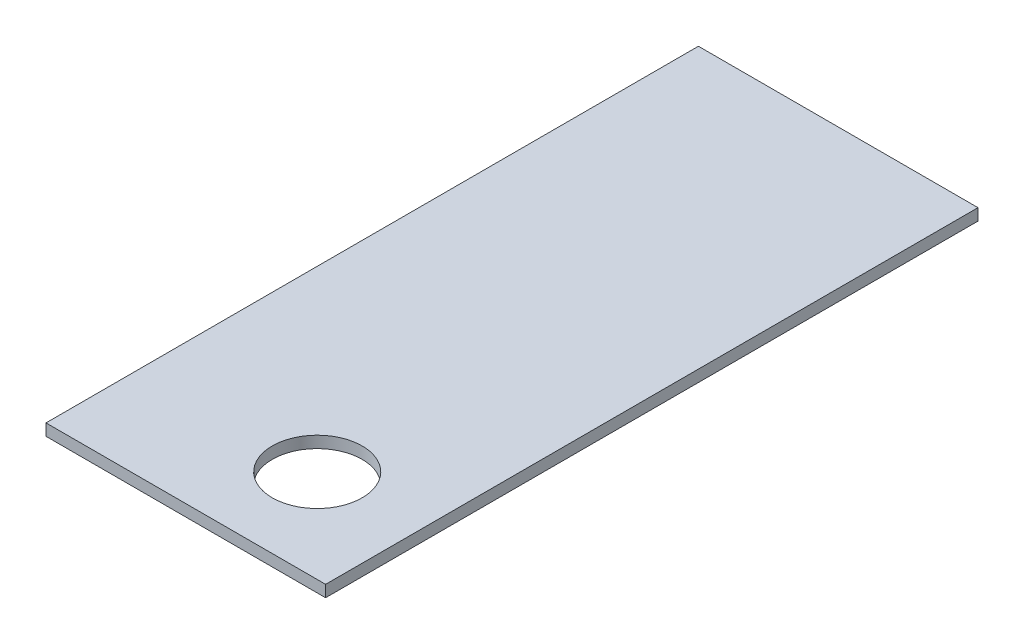
ISO-10303-21;
HEADER;
FILE_DESCRIPTION(('STEP AP214'),'2;1');
FILE_NAME('part.step','',(''),(''),'','','');
FILE_SCHEMA(('AUTOMOTIVE_DESIGN { 1 0 10303 214 1 1 1 1 }'));
ENDSEC;
DATA;
#1=APPLICATION_CONTEXT('core data for automotive mechanical design processes');
#2=APPLICATION_PROTOCOL_DEFINITION('international standard','automotive_design',2000,#1);
#3=PRODUCT_CONTEXT('',#1,'mechanical');
#4=PRODUCT('Part','Part','',(#3));
#5=PRODUCT_RELATED_PRODUCT_CATEGORY('part','',(#4));
#6=PRODUCT_DEFINITION_FORMATION('','',#4);
#7=PRODUCT_DEFINITION_CONTEXT('part definition',#1,'design');
#8=PRODUCT_DEFINITION('design','',#6,#7);
#9=PRODUCT_DEFINITION_SHAPE('','',#8);
#10=(LENGTH_UNIT() NAMED_UNIT(*) SI_UNIT(.MILLI.,.METRE.));
#11=(NAMED_UNIT(*) PLANE_ANGLE_UNIT() SI_UNIT($,.RADIAN.));
#12=(NAMED_UNIT(*) SI_UNIT($,.STERADIAN.) SOLID_ANGLE_UNIT());
#13=UNCERTAINTY_MEASURE_WITH_UNIT(LENGTH_MEASURE(1.E-05),#10,'distance_accuracy_value','');
#14=(GEOMETRIC_REPRESENTATION_CONTEXT(3) GLOBAL_UNCERTAINTY_ASSIGNED_CONTEXT((#13)) GLOBAL_UNIT_ASSIGNED_CONTEXT((#10,
#11,#12)) REPRESENTATION_CONTEXT('',''));
#15=CARTESIAN_POINT('',(0.,0.,0.));
#16=DIRECTION('',(0.,0.,1.));
#17=DIRECTION('',(1.,0.,0.));
#18=AXIS2_PLACEMENT_3D('',#15,#16,#17);
#19=CARTESIAN_POINT('',(0.,3.175,0.));
#20=DIRECTION('',(0.,-1.,0.));
#21=DIRECTION('',(0.,0.,-1.));
#22=AXIS2_PLACEMENT_3D('',#19,#20,#21);
#23=PLANE('',#22);
#24=DIRECTION('',(0.,0.,1.));
#25=VECTOR('',#24,1.);
#26=CARTESIAN_POINT('',(0.,3.175,0.));
#27=LINE('',#26,#25);
#28=CARTESIAN_POINT('',(0.,3.175,-177.8));
#29=VERTEX_POINT('',#28);
#30=CARTESIAN_POINT('',(0.,3.175,0.));
#31=VERTEX_POINT('',#30);
#32=EDGE_CURVE('E85',#29,#31,#27,.T.);
#33=ORIENTED_EDGE('',*,*,#32,.T.);
#34=DIRECTION('',(1.,0.,0.));
#35=VECTOR('',#34,1.);
#36=CARTESIAN_POINT('',(0.,3.175,0.));
#37=LINE('',#36,#35);
#38=CARTESIAN_POINT('',(76.2,3.175,0.));
#39=VERTEX_POINT('',#38);
#40=EDGE_CURVE('E80',#31,#39,#37,.T.);
#41=ORIENTED_EDGE('',*,*,#40,.T.);
#42=DIRECTION('',(0.,0.,-1.));
#43=VECTOR('',#42,1.);
#44=CARTESIAN_POINT('',(76.2,3.175,0.));
#45=LINE('',#44,#43);
#46=CARTESIAN_POINT('',(76.2,3.175,-177.8));
#47=VERTEX_POINT('',#46);
#48=EDGE_CURVE('E83',#39,#47,#45,.T.);
#49=ORIENTED_EDGE('',*,*,#48,.T.);
#50=DIRECTION('',(-1.,0.,0.));
#51=VECTOR('',#50,1.);
#52=CARTESIAN_POINT('',(0.,3.175,-177.8));
#53=LINE('',#52,#51);
#54=EDGE_CURVE('E50',#47,#29,#53,.T.);
#55=ORIENTED_EDGE('',*,*,#54,.T.);
#56=EDGE_LOOP('',(#33,#41,#49,#55));
#57=FACE_BOUND('',#56,.T.);
#58=CARTESIAN_POINT('',(48.514,3.175,-25.4));
#59=DIRECTION('',(0.,1.,0.));
#60=DIRECTION('',(0.,0.,1.));
#61=AXIS2_PLACEMENT_3D('',#58,#59,#60);
#62=CIRCLE('',#61,12.25);
#63=CARTESIAN_POINT('',(48.514,3.175,-13.15));
#64=VERTEX_POINT('',#63);
#65=EDGE_CURVE('E100',#64,#64,#62,.T.);
#66=ORIENTED_EDGE('',*,*,#65,.F.);
#67=EDGE_LOOP('',(#66));
#68=FACE_BOUND('',#67,.T.);
#69=ADVANCED_FACE('F33',(#57,#68),#23,.F.);
#70=CARTESIAN_POINT('',(0.,0.,0.));
#71=DIRECTION('',(0.,-1.,0.));
#72=DIRECTION('',(0.,0.,-1.));
#73=AXIS2_PLACEMENT_3D('',#70,#71,#72);
#74=PLANE('',#73);
#75=DIRECTION('',(0.,0.,1.));
#76=VECTOR('',#75,1.);
#77=CARTESIAN_POINT('',(0.,0.,0.));
#78=LINE('',#77,#76);
#79=CARTESIAN_POINT('',(0.,0.,-177.8));
#80=VERTEX_POINT('',#79);
#81=CARTESIAN_POINT('',(0.,0.,0.));
#82=VERTEX_POINT('',#81);
#83=EDGE_CURVE('E97',#80,#82,#78,.T.);
#84=ORIENTED_EDGE('',*,*,#83,.F.);
#85=DIRECTION('',(-1.,0.,0.));
#86=VECTOR('',#85,1.);
#87=CARTESIAN_POINT('',(0.,0.,-177.8));
#88=LINE('',#87,#86);
#89=CARTESIAN_POINT('',(76.2,0.,-177.8));
#90=VERTEX_POINT('',#89);
#91=EDGE_CURVE('E73',#90,#80,#88,.T.);
#92=ORIENTED_EDGE('',*,*,#91,.F.);
#93=DIRECTION('',(0.,0.,-1.));
#94=VECTOR('',#93,1.);
#95=CARTESIAN_POINT('',(76.2,0.,0.));
#96=LINE('',#95,#94);
#97=CARTESIAN_POINT('',(76.2,0.,0.));
#98=VERTEX_POINT('',#97);
#99=EDGE_CURVE('E67',#98,#90,#96,.T.);
#100=ORIENTED_EDGE('',*,*,#99,.F.);
#101=DIRECTION('',(1.,0.,0.));
#102=VECTOR('',#101,1.);
#103=CARTESIAN_POINT('',(0.,0.,0.));
#104=LINE('',#103,#102);
#105=EDGE_CURVE('E89',#82,#98,#104,.T.);
#106=ORIENTED_EDGE('',*,*,#105,.F.);
#107=EDGE_LOOP('',(#84,#92,#100,#106));
#108=FACE_BOUND('',#107,.T.);
#109=CARTESIAN_POINT('',(48.514,0.,-25.4));
#110=DIRECTION('',(0.,1.,0.));
#111=DIRECTION('',(0.,0.,1.));
#112=AXIS2_PLACEMENT_3D('',#109,#110,#111);
#113=CIRCLE('',#112,12.25);
#114=CARTESIAN_POINT('',(48.514,0.,-13.15));
#115=VERTEX_POINT('',#114);
#116=EDGE_CURVE('E112',#115,#115,#113,.T.);
#117=ORIENTED_EDGE('',*,*,#116,.T.);
#118=EDGE_LOOP('',(#117));
#119=FACE_BOUND('',#118,.T.);
#120=ADVANCED_FACE('F108',(#108,#119),#74,.T.);
#121=CARTESIAN_POINT('',(0.,3.175,0.));
#122=DIRECTION('',(1.,0.,0.));
#123=DIRECTION('',(0.,0.,-1.));
#124=AXIS2_PLACEMENT_3D('',#121,#122,#123);
#125=PLANE('',#124);
#126=ORIENTED_EDGE('',*,*,#83,.T.);
#127=DIRECTION('',(0.,-1.,0.));
#128=VECTOR('',#127,1.);
#129=CARTESIAN_POINT('',(0.,3.175,0.));
#130=LINE('',#129,#128);
#131=EDGE_CURVE('E11',#31,#82,#130,.T.);
#132=ORIENTED_EDGE('',*,*,#131,.F.);
#133=ORIENTED_EDGE('',*,*,#32,.F.);
#134=DIRECTION('',(0.,-1.,0.));
#135=VECTOR('',#134,1.);
#136=CARTESIAN_POINT('',(0.,3.175,-177.8));
#137=LINE('',#136,#135);
#138=EDGE_CURVE('E93',#29,#80,#137,.T.);
#139=ORIENTED_EDGE('',*,*,#138,.T.);
#140=EDGE_LOOP('',(#126,#132,#133,#139));
#141=FACE_BOUND('',#140,.T.);
#142=ADVANCED_FACE('F35',(#141),#125,.F.);
#143=CARTESIAN_POINT('',(0.,3.175,0.));
#144=DIRECTION('',(0.,0.,-1.));
#145=DIRECTION('',(-1.,0.,0.));
#146=AXIS2_PLACEMENT_3D('',#143,#144,#145);
#147=PLANE('',#146);
#148=ORIENTED_EDGE('',*,*,#105,.T.);
#149=DIRECTION('',(0.,-1.,0.));
#150=VECTOR('',#149,1.);
#151=CARTESIAN_POINT('',(76.2,3.175,0.));
#152=LINE('',#151,#150);
#153=EDGE_CURVE('E42',#39,#98,#152,.T.);
#154=ORIENTED_EDGE('',*,*,#153,.F.);
#155=ORIENTED_EDGE('',*,*,#40,.F.);
#156=ORIENTED_EDGE('',*,*,#131,.T.);
#157=EDGE_LOOP('',(#148,#154,#155,#156));
#158=FACE_BOUND('',#157,.T.);
#159=ADVANCED_FACE('F88',(#158),#147,.F.);
#160=CARTESIAN_POINT('',(76.2,3.175,0.));
#161=DIRECTION('',(-1.,0.,0.));
#162=DIRECTION('',(0.,0.,1.));
#163=AXIS2_PLACEMENT_3D('',#160,#161,#162);
#164=PLANE('',#163);
#165=ORIENTED_EDGE('',*,*,#99,.T.);
#166=DIRECTION('',(0.,-1.,0.));
#167=VECTOR('',#166,1.);
#168=CARTESIAN_POINT('',(76.2,3.175,-177.8));
#169=LINE('',#168,#167);
#170=EDGE_CURVE('E90',#47,#90,#169,.T.);
#171=ORIENTED_EDGE('',*,*,#170,.F.);
#172=ORIENTED_EDGE('',*,*,#48,.F.);
#173=ORIENTED_EDGE('',*,*,#153,.T.);
#174=EDGE_LOOP('',(#165,#171,#172,#173));
#175=FACE_BOUND('',#174,.T.);
#176=ADVANCED_FACE('F91',(#175),#164,.F.);
#177=CARTESIAN_POINT('',(0.,3.175,-177.8));
#178=DIRECTION('',(0.,0.,1.));
#179=DIRECTION('',(1.,0.,0.));
#180=AXIS2_PLACEMENT_3D('',#177,#178,#179);
#181=PLANE('',#180);
#182=ORIENTED_EDGE('',*,*,#91,.T.);
#183=ORIENTED_EDGE('',*,*,#138,.F.);
#184=ORIENTED_EDGE('',*,*,#54,.F.);
#185=ORIENTED_EDGE('',*,*,#170,.T.);
#186=EDGE_LOOP('',(#182,#183,#184,#185));
#187=FACE_BOUND('',#186,.T.);
#188=ADVANCED_FACE('F105',(#187),#181,.F.);
#189=CARTESIAN_POINT('',(48.514,3.175,-25.4));
#190=DIRECTION('',(0.,-1.,0.));
#191=DIRECTION('',(0.,0.,-1.));
#192=AXIS2_PLACEMENT_3D('',#189,#190,#191);
#193=CYLINDRICAL_SURFACE('',#192,12.25);
#194=ORIENTED_EDGE('',*,*,#65,.T.);
#195=EDGE_LOOP('',(#194));
#196=FACE_BOUND('',#195,.T.);
#197=ORIENTED_EDGE('',*,*,#116,.F.);
#198=EDGE_LOOP('',(#197));
#199=FACE_BOUND('',#198,.T.);
#200=ADVANCED_FACE('F118',(#196,#199),#193,.F.);
#201=CLOSED_SHELL('',(#69,#120,#142,#159,#176,#188,#200));
#202=MANIFOLD_SOLID_BREP('B2',#201);
#203=ADVANCED_BREP_SHAPE_REPRESENTATION('',(#18,#202),#14);
#204=SHAPE_DEFINITION_REPRESENTATION(#9,#203);
ENDSEC;
END-ISO-10303-21;
